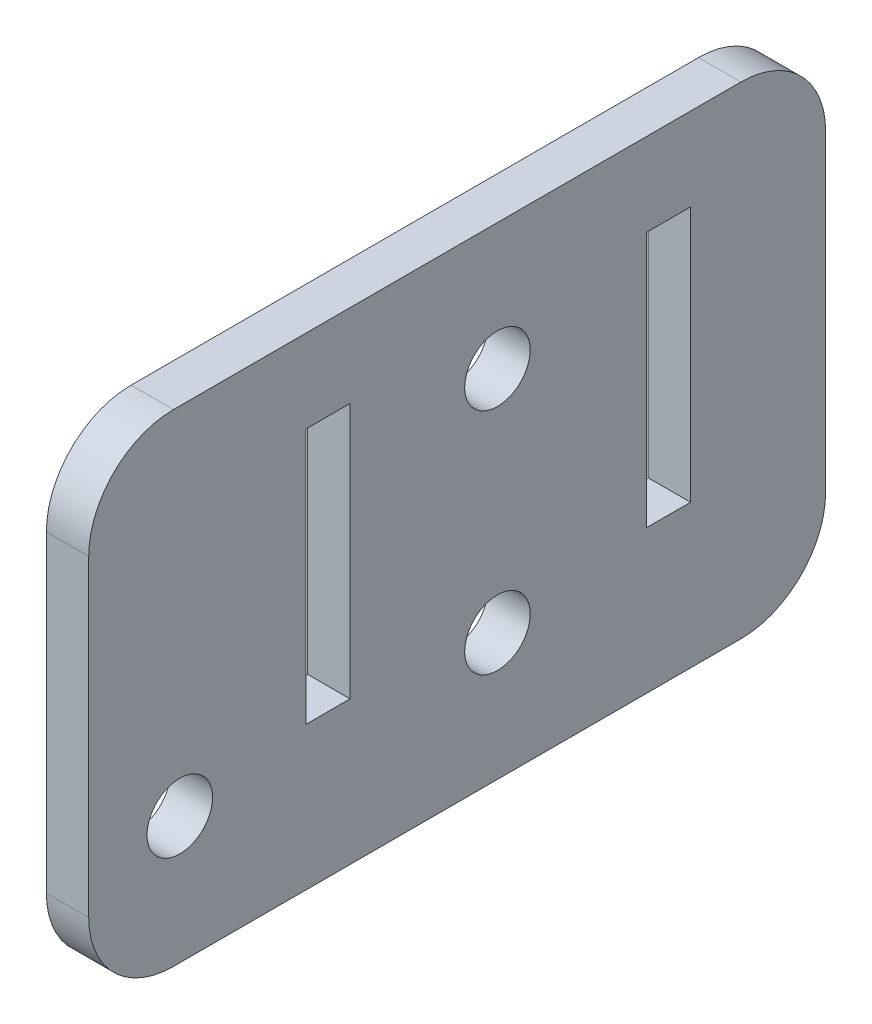
ISO-10303-21;
HEADER;
FILE_DESCRIPTION(('STEP AP214'),'2;1');
FILE_NAME('part.step','',(''),(''),'','','');
FILE_SCHEMA(('AUTOMOTIVE_DESIGN { 1 0 10303 214 1 1 1 1 }'));
ENDSEC;
DATA;
#1=APPLICATION_CONTEXT('core data for automotive mechanical design processes');
#2=APPLICATION_PROTOCOL_DEFINITION('international standard','automotive_design',2000,#1);
#3=PRODUCT_CONTEXT('',#1,'mechanical');
#4=PRODUCT('Part','Part','',(#3));
#5=PRODUCT_RELATED_PRODUCT_CATEGORY('part','',(#4));
#6=PRODUCT_DEFINITION_FORMATION('','',#4);
#7=PRODUCT_DEFINITION_CONTEXT('part definition',#1,'design');
#8=PRODUCT_DEFINITION('design','',#6,#7);
#9=PRODUCT_DEFINITION_SHAPE('','',#8);
#10=(LENGTH_UNIT() NAMED_UNIT(*) SI_UNIT(.MILLI.,.METRE.));
#11=(NAMED_UNIT(*) PLANE_ANGLE_UNIT() SI_UNIT($,.RADIAN.));
#12=(NAMED_UNIT(*) SI_UNIT($,.STERADIAN.) SOLID_ANGLE_UNIT());
#13=UNCERTAINTY_MEASURE_WITH_UNIT(LENGTH_MEASURE(1.E-05),#10,'distance_accuracy_value','');
#14=(GEOMETRIC_REPRESENTATION_CONTEXT(3) GLOBAL_UNCERTAINTY_ASSIGNED_CONTEXT((#13)) GLOBAL_UNIT_ASSIGNED_CONTEXT((#10,
#11,#12)) REPRESENTATION_CONTEXT('',''));
#15=CARTESIAN_POINT('',(0.,0.,0.));
#16=DIRECTION('',(0.,0.,1.));
#17=DIRECTION('',(1.,0.,0.));
#18=AXIS2_PLACEMENT_3D('',#15,#16,#17);
#19=CARTESIAN_POINT('',(3.175,0.,0.));
#20=DIRECTION('',(0.,1.,0.));
#21=DIRECTION('',(0.,0.,1.));
#22=AXIS2_PLACEMENT_3D('',#19,#20,#21);
#23=PLANE('',#22);
#24=DIRECTION('',(0.,0.,-1.));
#25=VECTOR('',#24,1.);
#26=CARTESIAN_POINT('',(3.175,0.,0.));
#27=LINE('',#26,#25);
#28=CARTESIAN_POINT('',(3.175,0.,-6.35));
#29=VERTEX_POINT('',#28);
#30=CARTESIAN_POINT('',(3.175,0.,-48.895));
#31=VERTEX_POINT('',#30);
#32=EDGE_CURVE('E264',#29,#31,#27,.T.);
#33=ORIENTED_EDGE('',*,*,#32,.F.);
#34=DIRECTION('',(-1.,0.,0.));
#35=VECTOR('',#34,1.);
#36=CARTESIAN_POINT('',(3.175,0.,-6.35));
#37=LINE('',#36,#35);
#38=CARTESIAN_POINT('',(0.,0.,-6.35));
#39=VERTEX_POINT('',#38);
#40=EDGE_CURVE('E332',#29,#39,#37,.T.);
#41=ORIENTED_EDGE('',*,*,#40,.T.);
#42=DIRECTION('',(0.,0.,-1.));
#43=VECTOR('',#42,1.);
#44=CARTESIAN_POINT('',(0.,0.,0.));
#45=LINE('',#44,#43);
#46=CARTESIAN_POINT('',(0.,0.,-48.895));
#47=VERTEX_POINT('',#46);
#48=EDGE_CURVE('E215',#39,#47,#45,.T.);
#49=ORIENTED_EDGE('',*,*,#48,.T.);
#50=DIRECTION('',(-1.,0.,0.));
#51=VECTOR('',#50,1.);
#52=CARTESIAN_POINT('',(3.175,0.,-48.895));
#53=LINE('',#52,#51);
#54=EDGE_CURVE('E329',#47,#31,#53,.F.);
#55=ORIENTED_EDGE('',*,*,#54,.T.);
#56=EDGE_LOOP('',(#33,#41,#49,#55));
#57=FACE_BOUND('',#56,.T.);
#58=ADVANCED_FACE('F47',(#57),#23,.F.);
#59=CARTESIAN_POINT('',(3.175,0.,-55.245));
#60=DIRECTION('',(0.,0.,1.));
#61=DIRECTION('',(1.,0.,0.));
#62=AXIS2_PLACEMENT_3D('',#59,#60,#61);
#63=PLANE('',#62);
#64=DIRECTION('',(0.,1.,0.));
#65=VECTOR('',#64,1.);
#66=CARTESIAN_POINT('',(0.,0.,-55.245));
#67=LINE('',#66,#65);
#68=CARTESIAN_POINT('',(0.,6.35,-55.245));
#69=VERTEX_POINT('',#68);
#70=CARTESIAN_POINT('',(0.,29.80436,-55.245));
#71=VERTEX_POINT('',#70);
#72=EDGE_CURVE('E283',#69,#71,#67,.T.);
#73=ORIENTED_EDGE('',*,*,#72,.T.);
#74=DIRECTION('',(-1.,0.,0.));
#75=VECTOR('',#74,1.);
#76=CARTESIAN_POINT('',(3.175,29.80436,-55.245));
#77=LINE('',#76,#75);
#78=CARTESIAN_POINT('',(3.175,29.80436,-55.245));
#79=VERTEX_POINT('',#78);
#80=EDGE_CURVE('E11',#71,#79,#77,.F.);
#81=ORIENTED_EDGE('',*,*,#80,.T.);
#82=DIRECTION('',(0.,1.,0.));
#83=VECTOR('',#82,1.);
#84=CARTESIAN_POINT('',(3.175,0.,-55.245));
#85=LINE('',#84,#83);
#86=CARTESIAN_POINT('',(3.175,6.35,-55.245));
#87=VERTEX_POINT('',#86);
#88=EDGE_CURVE('E267',#87,#79,#85,.T.);
#89=ORIENTED_EDGE('',*,*,#88,.F.);
#90=DIRECTION('',(-1.,0.,0.));
#91=VECTOR('',#90,1.);
#92=CARTESIAN_POINT('',(3.175,6.35,-55.245));
#93=LINE('',#92,#91);
#94=EDGE_CURVE('E56',#87,#69,#93,.T.);
#95=ORIENTED_EDGE('',*,*,#94,.T.);
#96=EDGE_LOOP('',(#73,#81,#89,#95));
#97=FACE_BOUND('',#96,.T.);
#98=ADVANCED_FACE('F339',(#97),#63,.F.);
#99=CARTESIAN_POINT('',(3.175,36.15436,-55.245));
#100=DIRECTION('',(0.,-1.,0.));
#101=DIRECTION('',(0.,0.,-1.));
#102=AXIS2_PLACEMENT_3D('',#99,#100,#101);
#103=PLANE('',#102);
#104=DIRECTION('',(0.,0.,1.));
#105=VECTOR('',#104,1.);
#106=CARTESIAN_POINT('',(0.,36.15436,-55.245));
#107=LINE('',#106,#105);
#108=CARTESIAN_POINT('',(0.,36.15436,-48.895));
#109=VERTEX_POINT('',#108);
#110=CARTESIAN_POINT('',(0.,36.15436,-6.35));
#111=VERTEX_POINT('',#110);
#112=EDGE_CURVE('E286',#109,#111,#107,.T.);
#113=ORIENTED_EDGE('',*,*,#112,.T.);
#114=DIRECTION('',(-1.,0.,0.));
#115=VECTOR('',#114,1.);
#116=CARTESIAN_POINT('',(3.175,36.15436,-6.35));
#117=LINE('',#116,#115);
#118=CARTESIAN_POINT('',(3.175,36.15436,-6.35));
#119=VERTEX_POINT('',#118);
#120=EDGE_CURVE('E315',#111,#119,#117,.F.);
#121=ORIENTED_EDGE('',*,*,#120,.T.);
#122=DIRECTION('',(0.,0.,1.));
#123=VECTOR('',#122,1.);
#124=CARTESIAN_POINT('',(3.175,36.15436,-55.245));
#125=LINE('',#124,#123);
#126=CARTESIAN_POINT('',(3.175,36.15436,-48.895));
#127=VERTEX_POINT('',#126);
#128=EDGE_CURVE('E271',#127,#119,#125,.T.);
#129=ORIENTED_EDGE('',*,*,#128,.F.);
#130=DIRECTION('',(-1.,0.,0.));
#131=VECTOR('',#130,1.);
#132=CARTESIAN_POINT('',(3.175,36.15436,-48.895));
#133=LINE('',#132,#131);
#134=EDGE_CURVE('E311',#127,#109,#133,.T.);
#135=ORIENTED_EDGE('',*,*,#134,.T.);
#136=EDGE_LOOP('',(#113,#121,#129,#135));
#137=FACE_BOUND('',#136,.T.);
#138=ADVANCED_FACE('F352',(#137),#103,.F.);
#139=CARTESIAN_POINT('',(3.175,36.15436,0.));
#140=DIRECTION('',(0.,0.,-1.));
#141=DIRECTION('',(-1.,0.,0.));
#142=AXIS2_PLACEMENT_3D('',#139,#140,#141);
#143=PLANE('',#142);
#144=DIRECTION('',(0.,-1.,0.));
#145=VECTOR('',#144,1.);
#146=CARTESIAN_POINT('',(3.175,36.15436,0.));
#147=LINE('',#146,#145);
#148=CARTESIAN_POINT('',(3.175,29.80436,0.));
#149=VERTEX_POINT('',#148);
#150=CARTESIAN_POINT('',(3.175,6.35,0.));
#151=VERTEX_POINT('',#150);
#152=EDGE_CURVE('E275',#149,#151,#147,.T.);
#153=ORIENTED_EDGE('',*,*,#152,.F.);
#154=DIRECTION('',(-1.,0.,0.));
#155=VECTOR('',#154,1.);
#156=CARTESIAN_POINT('',(3.175,29.80436,0.));
#157=LINE('',#156,#155);
#158=CARTESIAN_POINT('',(0.,29.80436,0.));
#159=VERTEX_POINT('',#158);
#160=EDGE_CURVE('E295',#149,#159,#157,.T.);
#161=ORIENTED_EDGE('',*,*,#160,.T.);
#162=DIRECTION('',(0.,-1.,0.));
#163=VECTOR('',#162,1.);
#164=CARTESIAN_POINT('',(0.,36.15436,0.));
#165=LINE('',#164,#163);
#166=CARTESIAN_POINT('',(0.,6.35,0.));
#167=VERTEX_POINT('',#166);
#168=EDGE_CURVE('E268',#159,#167,#165,.T.);
#169=ORIENTED_EDGE('',*,*,#168,.T.);
#170=DIRECTION('',(-1.,0.,0.));
#171=VECTOR('',#170,1.);
#172=CARTESIAN_POINT('',(3.175,6.35,0.));
#173=LINE('',#172,#171);
#174=EDGE_CURVE('E279',#167,#151,#173,.F.);
#175=ORIENTED_EDGE('',*,*,#174,.T.);
#176=EDGE_LOOP('',(#153,#161,#169,#175));
#177=FACE_BOUND('',#176,.T.);
#178=ADVANCED_FACE('F360',(#177),#143,.F.);
#179=CARTESIAN_POINT('',(3.175,0.,0.));
#180=DIRECTION('',(1.,0.,0.));
#181=DIRECTION('',(0.,0.,-1.));
#182=AXIS2_PLACEMENT_3D('',#179,#180,#181);
#183=PLANE('',#182);
#184=CARTESIAN_POINT('',(3.175,9.525,-30.642153092));
#185=DIRECTION('',(1.,0.,0.));
#186=DIRECTION('',(0.,0.,-1.));
#187=AXIS2_PLACEMENT_3D('',#184,#185,#186);
#188=CIRCLE('',#187,2.45744999999999);
#189=CARTESIAN_POINT('',(3.175,9.525,-33.099603092));
#190=VERTEX_POINT('',#189);
#191=EDGE_CURVE('E591',#190,#190,#188,.T.);
#192=ORIENTED_EDGE('',*,*,#191,.F.);
#193=EDGE_LOOP('',(#192));
#194=FACE_BOUND('',#193,.T.);
#195=CARTESIAN_POINT('',(3.175,26.67,-30.642153092));
#196=DIRECTION('',(1.,0.,0.));
#197=DIRECTION('',(0.,0.,-1.));
#198=AXIS2_PLACEMENT_3D('',#195,#196,#197);
#199=CIRCLE('',#198,2.45744999999999);
#200=CARTESIAN_POINT('',(3.175,26.67,-33.099603092));
#201=VERTEX_POINT('',#200);
#202=EDGE_CURVE('E582',#201,#201,#199,.T.);
#203=ORIENTED_EDGE('',*,*,#202,.F.);
#204=EDGE_LOOP('',(#203));
#205=FACE_BOUND('',#204,.T.);
#206=CARTESIAN_POINT('',(3.175,9.525,-6.829653092));
#207=DIRECTION('',(1.,0.,0.));
#208=DIRECTION('',(0.,0.,-1.));
#209=AXIS2_PLACEMENT_3D('',#206,#207,#208);
#210=CIRCLE('',#209,2.45744999999999);
#211=CARTESIAN_POINT('',(3.175,9.525,-9.28710309199999));
#212=VERTEX_POINT('',#211);
#213=EDGE_CURVE('E196',#212,#212,#210,.T.);
#214=ORIENTED_EDGE('',*,*,#213,.F.);
#215=EDGE_LOOP('',(#214));
#216=FACE_BOUND('',#215,.T.);
#217=DIRECTION('',(0.,-1.,0.));
#218=VECTOR('',#217,1.);
#219=CARTESIAN_POINT('',(3.175,10.75436,-45.120153092));
#220=LINE('',#219,#218);
#221=CARTESIAN_POINT('',(3.175,29.93136,-45.120153092));
#222=VERTEX_POINT('',#221);
#223=CARTESIAN_POINT('',(3.175,10.75436,-45.120153092));
#224=VERTEX_POINT('',#223);
#225=EDGE_CURVE('E165',#222,#224,#220,.T.);
#226=ORIENTED_EDGE('',*,*,#225,.T.);
#227=DIRECTION('',(0.,0.,1.));
#228=VECTOR('',#227,1.);
#229=CARTESIAN_POINT('',(3.175,10.75436,-45.120153092));
#230=LINE('',#229,#228);
#231=CARTESIAN_POINT('',(3.175,10.75436,-41.818153092));
#232=VERTEX_POINT('',#231);
#233=EDGE_CURVE('E178',#224,#232,#230,.T.);
#234=ORIENTED_EDGE('',*,*,#233,.T.);
#235=DIRECTION('',(0.,1.,0.));
#236=VECTOR('',#235,1.);
#237=CARTESIAN_POINT('',(3.175,10.75436,-41.818153092));
#238=LINE('',#237,#236);
#239=CARTESIAN_POINT('',(3.175,29.93136,-41.818153092));
#240=VERTEX_POINT('',#239);
#241=EDGE_CURVE('E183',#232,#240,#238,.T.);
#242=ORIENTED_EDGE('',*,*,#241,.T.);
#243=DIRECTION('',(0.,0.,-1.));
#244=VECTOR('',#243,1.);
#245=CARTESIAN_POINT('',(3.175,29.93136,-45.120153092));
#246=LINE('',#245,#244);
#247=EDGE_CURVE('E174',#240,#222,#246,.T.);
#248=ORIENTED_EDGE('',*,*,#247,.T.);
#249=EDGE_LOOP('',(#226,#234,#242,#248));
#250=FACE_BOUND('',#249,.T.);
#251=DIRECTION('',(0.,-1.,0.));
#252=VECTOR('',#251,1.);
#253=CARTESIAN_POINT('',(3.175,10.75436,-19.593153092));
#254=LINE('',#253,#252);
#255=CARTESIAN_POINT('',(3.175,29.93136,-19.593153092));
#256=VERTEX_POINT('',#255);
#257=CARTESIAN_POINT('',(3.175,10.75436,-19.593153092));
#258=VERTEX_POINT('',#257);
#259=EDGE_CURVE('E221',#256,#258,#254,.T.);
#260=ORIENTED_EDGE('',*,*,#259,.T.);
#261=DIRECTION('',(0.,0.,1.));
#262=VECTOR('',#261,1.);
#263=CARTESIAN_POINT('',(3.175,10.75436,-19.593153092));
#264=LINE('',#263,#262);
#265=CARTESIAN_POINT('',(3.175,10.75436,-16.291153092));
#266=VERTEX_POINT('',#265);
#267=EDGE_CURVE('E225',#258,#266,#264,.T.);
#268=ORIENTED_EDGE('',*,*,#267,.T.);
#269=DIRECTION('',(0.,1.,0.));
#270=VECTOR('',#269,1.);
#271=CARTESIAN_POINT('',(3.175,10.75436,-16.291153092));
#272=LINE('',#271,#270);
#273=CARTESIAN_POINT('',(3.175,29.93136,-16.291153092));
#274=VERTEX_POINT('',#273);
#275=EDGE_CURVE('E230',#266,#274,#272,.T.);
#276=ORIENTED_EDGE('',*,*,#275,.T.);
#277=DIRECTION('',(0.,0.,-1.));
#278=VECTOR('',#277,1.);
#279=CARTESIAN_POINT('',(3.175,29.93136,-19.593153092));
#280=LINE('',#279,#278);
#281=EDGE_CURVE('E234',#274,#256,#280,.T.);
#282=ORIENTED_EDGE('',*,*,#281,.T.);
#283=EDGE_LOOP('',(#260,#268,#276,#282));
#284=FACE_BOUND('',#283,.T.);
#285=ORIENTED_EDGE('',*,*,#128,.T.);
#286=CARTESIAN_POINT('',(3.175,29.80436,-6.35));
#287=DIRECTION('',(1.,0.,0.));
#288=DIRECTION('',(0.,0.,-1.));
#289=AXIS2_PLACEMENT_3D('',#286,#287,#288);
#290=CIRCLE('',#289,6.35);
#291=EDGE_CURVE('E326',#119,#149,#290,.T.);
#292=ORIENTED_EDGE('',*,*,#291,.T.);
#293=ORIENTED_EDGE('',*,*,#152,.T.);
#294=CARTESIAN_POINT('',(3.175,6.35,-6.35));
#295=DIRECTION('',(1.,0.,0.));
#296=DIRECTION('',(0.,0.,-1.));
#297=AXIS2_PLACEMENT_3D('',#294,#295,#296);
#298=CIRCLE('',#297,6.35);
#299=EDGE_CURVE('E323',#151,#29,#298,.T.);
#300=ORIENTED_EDGE('',*,*,#299,.T.);
#301=ORIENTED_EDGE('',*,*,#32,.T.);
#302=CARTESIAN_POINT('',(3.175,6.35,-48.895));
#303=DIRECTION('',(1.,0.,0.));
#304=DIRECTION('',(0.,0.,-1.));
#305=AXIS2_PLACEMENT_3D('',#302,#303,#304);
#306=CIRCLE('',#305,6.35);
#307=EDGE_CURVE('E68',#31,#87,#306,.T.);
#308=ORIENTED_EDGE('',*,*,#307,.T.);
#309=ORIENTED_EDGE('',*,*,#88,.T.);
#310=CARTESIAN_POINT('',(3.175,29.80436,-48.895));
#311=DIRECTION('',(1.,0.,0.));
#312=DIRECTION('',(0.,0.,-1.));
#313=AXIS2_PLACEMENT_3D('',#310,#311,#312);
#314=CIRCLE('',#313,6.35);
#315=EDGE_CURVE('E320',#79,#127,#314,.T.);
#316=ORIENTED_EDGE('',*,*,#315,.T.);
#317=EDGE_LOOP('',(#285,#292,#293,#300,#301,#308,#309,#316));
#318=FACE_BOUND('',#317,.T.);
#319=ADVANCED_FACE('F185',(#194,#205,#216,#250,#284,#318),#183,.T.);
#320=CARTESIAN_POINT('',(0.,0.,0.));
#321=DIRECTION('',(1.,0.,0.));
#322=DIRECTION('',(0.,0.,-1.));
#323=AXIS2_PLACEMENT_3D('',#320,#321,#322);
#324=PLANE('',#323);
#325=CARTESIAN_POINT('',(0.,9.525,-30.642153092));
#326=DIRECTION('',(-1.,0.,0.));
#327=DIRECTION('',(0.,0.,1.));
#328=AXIS2_PLACEMENT_3D('',#325,#326,#327);
#329=CIRCLE('',#328,2.45744999999999);
#330=CARTESIAN_POINT('',(0.,9.525,-28.184703092));
#331=VERTEX_POINT('',#330);
#332=EDGE_CURVE('E560',#331,#331,#329,.T.);
#333=ORIENTED_EDGE('',*,*,#332,.F.);
#334=EDGE_LOOP('',(#333));
#335=FACE_BOUND('',#334,.T.);
#336=CARTESIAN_POINT('',(0.,26.67,-30.642153092));
#337=DIRECTION('',(-1.,0.,0.));
#338=DIRECTION('',(0.,0.,1.));
#339=AXIS2_PLACEMENT_3D('',#336,#337,#338);
#340=CIRCLE('',#339,2.45744999999999);
#341=CARTESIAN_POINT('',(0.,26.67,-28.184703092));
#342=VERTEX_POINT('',#341);
#343=EDGE_CURVE('E564',#342,#342,#340,.T.);
#344=ORIENTED_EDGE('',*,*,#343,.F.);
#345=EDGE_LOOP('',(#344));
#346=FACE_BOUND('',#345,.T.);
#347=CARTESIAN_POINT('',(0.,9.525,-6.829653092));
#348=DIRECTION('',(-1.,0.,0.));
#349=DIRECTION('',(0.,0.,1.));
#350=AXIS2_PLACEMENT_3D('',#347,#348,#349);
#351=CIRCLE('',#350,2.45744999999999);
#352=CARTESIAN_POINT('',(0.,9.525,-4.37220309200001));
#353=VERTEX_POINT('',#352);
#354=EDGE_CURVE('E568',#353,#353,#351,.T.);
#355=ORIENTED_EDGE('',*,*,#354,.F.);
#356=EDGE_LOOP('',(#355));
#357=FACE_BOUND('',#356,.T.);
#358=DIRECTION('',(0.,0.,1.));
#359=VECTOR('',#358,1.);
#360=CARTESIAN_POINT('',(0.,10.75436,-45.120153092));
#361=LINE('',#360,#359);
#362=CARTESIAN_POINT('',(0.,10.75436,-45.120153092));
#363=VERTEX_POINT('',#362);
#364=CARTESIAN_POINT('',(0.,10.75436,-41.818153092));
#365=VERTEX_POINT('',#364);
#366=EDGE_CURVE('E205',#363,#365,#361,.T.);
#367=ORIENTED_EDGE('',*,*,#366,.F.);
#368=DIRECTION('',(0.,-1.,0.));
#369=VECTOR('',#368,1.);
#370=CARTESIAN_POINT('',(0.,10.75436,-45.120153092));
#371=LINE('',#370,#369);
#372=CARTESIAN_POINT('',(0.,29.93136,-45.120153092));
#373=VERTEX_POINT('',#372);
#374=EDGE_CURVE('E168',#373,#363,#371,.T.);
#375=ORIENTED_EDGE('',*,*,#374,.F.);
#376=DIRECTION('',(0.,0.,-1.));
#377=VECTOR('',#376,1.);
#378=CARTESIAN_POINT('',(0.,29.93136,-45.120153092));
#379=LINE('',#378,#377);
#380=CARTESIAN_POINT('',(0.,29.93136,-41.818153092));
#381=VERTEX_POINT('',#380);
#382=EDGE_CURVE('E189',#381,#373,#379,.T.);
#383=ORIENTED_EDGE('',*,*,#382,.F.);
#384=DIRECTION('',(0.,1.,0.));
#385=VECTOR('',#384,1.);
#386=CARTESIAN_POINT('',(0.,10.75436,-41.818153092));
#387=LINE('',#386,#385);
#388=EDGE_CURVE('E193',#365,#381,#387,.T.);
#389=ORIENTED_EDGE('',*,*,#388,.F.);
#390=EDGE_LOOP('',(#367,#375,#383,#389));
#391=FACE_BOUND('',#390,.T.);
#392=DIRECTION('',(0.,0.,1.));
#393=VECTOR('',#392,1.);
#394=CARTESIAN_POINT('',(0.,10.75436,-19.593153092));
#395=LINE('',#394,#393);
#396=CARTESIAN_POINT('',(0.,10.75436,-19.593153092));
#397=VERTEX_POINT('',#396);
#398=CARTESIAN_POINT('',(0.,10.75436,-16.291153092));
#399=VERTEX_POINT('',#398);
#400=EDGE_CURVE('E242',#397,#399,#395,.T.);
#401=ORIENTED_EDGE('',*,*,#400,.F.);
#402=DIRECTION('',(0.,-1.,0.));
#403=VECTOR('',#402,1.);
#404=CARTESIAN_POINT('',(0.,10.75436,-19.593153092));
#405=LINE('',#404,#403);
#406=CARTESIAN_POINT('',(0.,29.93136,-19.593153092));
#407=VERTEX_POINT('',#406);
#408=EDGE_CURVE('E239',#407,#397,#405,.T.);
#409=ORIENTED_EDGE('',*,*,#408,.F.);
#410=DIRECTION('',(0.,0.,-1.));
#411=VECTOR('',#410,1.);
#412=CARTESIAN_POINT('',(0.,29.93136,-19.593153092));
#413=LINE('',#412,#411);
#414=CARTESIAN_POINT('',(0.,29.93136,-16.291153092));
#415=VERTEX_POINT('',#414);
#416=EDGE_CURVE('E226',#415,#407,#413,.T.);
#417=ORIENTED_EDGE('',*,*,#416,.F.);
#418=DIRECTION('',(0.,1.,0.));
#419=VECTOR('',#418,1.);
#420=CARTESIAN_POINT('',(0.,10.75436,-16.291153092));
#421=LINE('',#420,#419);
#422=EDGE_CURVE('E246',#399,#415,#421,.T.);
#423=ORIENTED_EDGE('',*,*,#422,.F.);
#424=EDGE_LOOP('',(#401,#409,#417,#423));
#425=FACE_BOUND('',#424,.T.);
#426=ORIENTED_EDGE('',*,*,#168,.F.);
#427=CARTESIAN_POINT('',(0.,29.80436,-6.35));
#428=DIRECTION('',(1.,0.,0.));
#429=DIRECTION('',(0.,0.,-1.));
#430=AXIS2_PLACEMENT_3D('',#427,#428,#429);
#431=CIRCLE('',#430,6.35);
#432=EDGE_CURVE('E308',#159,#111,#431,.F.);
#433=ORIENTED_EDGE('',*,*,#432,.T.);
#434=ORIENTED_EDGE('',*,*,#112,.F.);
#435=CARTESIAN_POINT('',(0.,29.80436,-48.895));
#436=DIRECTION('',(1.,0.,0.));
#437=DIRECTION('',(0.,0.,-1.));
#438=AXIS2_PLACEMENT_3D('',#435,#436,#437);
#439=CIRCLE('',#438,6.35);
#440=EDGE_CURVE('E302',#109,#71,#439,.F.);
#441=ORIENTED_EDGE('',*,*,#440,.T.);
#442=ORIENTED_EDGE('',*,*,#72,.F.);
#443=CARTESIAN_POINT('',(0.,6.35,-48.895));
#444=DIRECTION('',(1.,0.,0.));
#445=DIRECTION('',(0.,0.,-1.));
#446=AXIS2_PLACEMENT_3D('',#443,#444,#445);
#447=CIRCLE('',#446,6.35);
#448=EDGE_CURVE('E299',#69,#47,#447,.F.);
#449=ORIENTED_EDGE('',*,*,#448,.T.);
#450=ORIENTED_EDGE('',*,*,#48,.F.);
#451=CARTESIAN_POINT('',(0.,6.35,-6.35));
#452=DIRECTION('',(1.,0.,0.));
#453=DIRECTION('',(0.,0.,-1.));
#454=AXIS2_PLACEMENT_3D('',#451,#452,#453);
#455=CIRCLE('',#454,6.35);
#456=EDGE_CURVE('E305',#39,#167,#455,.F.);
#457=ORIENTED_EDGE('',*,*,#456,.T.);
#458=EDGE_LOOP('',(#426,#433,#434,#441,#442,#449,#450,#457));
#459=FACE_BOUND('',#458,.T.);
#460=ADVANCED_FACE('F343',(#335,#346,#357,#391,#425,#459),#324,.F.);
#461=CARTESIAN_POINT('',(3.175,10.75436,-19.593153092));
#462=DIRECTION('',(0.,0.,-1.));
#463=DIRECTION('',(-1.,0.,0.));
#464=AXIS2_PLACEMENT_3D('',#461,#462,#463);
#465=PLANE('',#464);
#466=ORIENTED_EDGE('',*,*,#408,.T.);
#467=DIRECTION('',(-1.,0.,0.));
#468=VECTOR('',#467,1.);
#469=CARTESIAN_POINT('',(3.175,10.75436,-19.593153092));
#470=LINE('',#469,#468);
#471=EDGE_CURVE('E238',#258,#397,#470,.T.);
#472=ORIENTED_EDGE('',*,*,#471,.F.);
#473=ORIENTED_EDGE('',*,*,#259,.F.);
#474=DIRECTION('',(-1.,0.,0.));
#475=VECTOR('',#474,1.);
#476=CARTESIAN_POINT('',(3.175,29.93136,-19.593153092));
#477=LINE('',#476,#475);
#478=EDGE_CURVE('E206',#256,#407,#477,.T.);
#479=ORIENTED_EDGE('',*,*,#478,.T.);
#480=EDGE_LOOP('',(#466,#472,#473,#479));
#481=FACE_BOUND('',#480,.T.);
#482=ADVANCED_FACE('F454',(#481),#465,.F.);
#483=CARTESIAN_POINT('',(3.175,29.93136,-19.593153092));
#484=DIRECTION('',(0.,1.,0.));
#485=DIRECTION('',(0.,0.,1.));
#486=AXIS2_PLACEMENT_3D('',#483,#484,#485);
#487=PLANE('',#486);
#488=ORIENTED_EDGE('',*,*,#416,.T.);
#489=ORIENTED_EDGE('',*,*,#478,.F.);
#490=ORIENTED_EDGE('',*,*,#281,.F.);
#491=DIRECTION('',(-1.,0.,0.));
#492=VECTOR('',#491,1.);
#493=CARTESIAN_POINT('',(3.175,29.93136,-16.291153092));
#494=LINE('',#493,#492);
#495=EDGE_CURVE('E255',#274,#415,#494,.T.);
#496=ORIENTED_EDGE('',*,*,#495,.T.);
#497=EDGE_LOOP('',(#488,#489,#490,#496));
#498=FACE_BOUND('',#497,.T.);
#499=ADVANCED_FACE('F450',(#498),#487,.F.);
#500=CARTESIAN_POINT('',(3.175,10.75436,-16.291153092));
#501=DIRECTION('',(0.,0.,1.));
#502=DIRECTION('',(1.,0.,0.));
#503=AXIS2_PLACEMENT_3D('',#500,#501,#502);
#504=PLANE('',#503);
#505=ORIENTED_EDGE('',*,*,#422,.T.);
#506=ORIENTED_EDGE('',*,*,#495,.F.);
#507=ORIENTED_EDGE('',*,*,#275,.F.);
#508=DIRECTION('',(-1.,0.,0.));
#509=VECTOR('',#508,1.);
#510=CARTESIAN_POINT('',(3.175,10.75436,-16.291153092));
#511=LINE('',#510,#509);
#512=EDGE_CURVE('E258',#266,#399,#511,.T.);
#513=ORIENTED_EDGE('',*,*,#512,.T.);
#514=EDGE_LOOP('',(#505,#506,#507,#513));
#515=FACE_BOUND('',#514,.T.);
#516=ADVANCED_FACE('F453',(#515),#504,.F.);
#517=CARTESIAN_POINT('',(3.175,10.75436,-19.593153092));
#518=DIRECTION('',(0.,-1.,0.));
#519=DIRECTION('',(0.,0.,-1.));
#520=AXIS2_PLACEMENT_3D('',#517,#518,#519);
#521=PLANE('',#520);
#522=ORIENTED_EDGE('',*,*,#400,.T.);
#523=ORIENTED_EDGE('',*,*,#512,.F.);
#524=ORIENTED_EDGE('',*,*,#267,.F.);
#525=ORIENTED_EDGE('',*,*,#471,.T.);
#526=EDGE_LOOP('',(#522,#523,#524,#525));
#527=FACE_BOUND('',#526,.T.);
#528=ADVANCED_FACE('F449',(#527),#521,.F.);
#529=CARTESIAN_POINT('',(3.175,10.75436,-45.120153092));
#530=DIRECTION('',(0.,0.,-1.));
#531=DIRECTION('',(-1.,0.,0.));
#532=AXIS2_PLACEMENT_3D('',#529,#530,#531);
#533=PLANE('',#532);
#534=ORIENTED_EDGE('',*,*,#374,.T.);
#535=DIRECTION('',(-1.,0.,0.));
#536=VECTOR('',#535,1.);
#537=CARTESIAN_POINT('',(3.175,10.75436,-45.120153092));
#538=LINE('',#537,#536);
#539=EDGE_CURVE('E161',#224,#363,#538,.T.);
#540=ORIENTED_EDGE('',*,*,#539,.F.);
#541=ORIENTED_EDGE('',*,*,#225,.F.);
#542=DIRECTION('',(-1.,0.,0.));
#543=VECTOR('',#542,1.);
#544=CARTESIAN_POINT('',(3.175,29.93136,-45.120153092));
#545=LINE('',#544,#543);
#546=EDGE_CURVE('E212',#222,#373,#545,.T.);
#547=ORIENTED_EDGE('',*,*,#546,.T.);
#548=EDGE_LOOP('',(#534,#540,#541,#547));
#549=FACE_BOUND('',#548,.T.);
#550=ADVANCED_FACE('F163',(#549),#533,.F.);
#551=CARTESIAN_POINT('',(3.175,29.93136,-45.120153092));
#552=DIRECTION('',(0.,1.,0.));
#553=DIRECTION('',(0.,0.,1.));
#554=AXIS2_PLACEMENT_3D('',#551,#552,#553);
#555=PLANE('',#554);
#556=ORIENTED_EDGE('',*,*,#382,.T.);
#557=ORIENTED_EDGE('',*,*,#546,.F.);
#558=ORIENTED_EDGE('',*,*,#247,.F.);
#559=DIRECTION('',(-1.,0.,0.));
#560=VECTOR('',#559,1.);
#561=CARTESIAN_POINT('',(3.175,29.93136,-41.818153092));
#562=LINE('',#561,#560);
#563=EDGE_CURVE('E216',#240,#381,#562,.T.);
#564=ORIENTED_EDGE('',*,*,#563,.T.);
#565=EDGE_LOOP('',(#556,#557,#558,#564));
#566=FACE_BOUND('',#565,.T.);
#567=ADVANCED_FACE('F438',(#566),#555,.F.);
#568=CARTESIAN_POINT('',(3.175,10.75436,-41.818153092));
#569=DIRECTION('',(0.,0.,1.));
#570=DIRECTION('',(1.,0.,0.));
#571=AXIS2_PLACEMENT_3D('',#568,#569,#570);
#572=PLANE('',#571);
#573=ORIENTED_EDGE('',*,*,#388,.T.);
#574=ORIENTED_EDGE('',*,*,#563,.F.);
#575=ORIENTED_EDGE('',*,*,#241,.F.);
#576=DIRECTION('',(-1.,0.,0.));
#577=VECTOR('',#576,1.);
#578=CARTESIAN_POINT('',(3.175,10.75436,-41.818153092));
#579=LINE('',#578,#577);
#580=EDGE_CURVE('E173',#232,#365,#579,.T.);
#581=ORIENTED_EDGE('',*,*,#580,.T.);
#582=EDGE_LOOP('',(#573,#574,#575,#581));
#583=FACE_BOUND('',#582,.T.);
#584=ADVANCED_FACE('F441',(#583),#572,.F.);
#585=CARTESIAN_POINT('',(3.175,10.75436,-45.120153092));
#586=DIRECTION('',(0.,-1.,0.));
#587=DIRECTION('',(0.,0.,-1.));
#588=AXIS2_PLACEMENT_3D('',#585,#586,#587);
#589=PLANE('',#588);
#590=ORIENTED_EDGE('',*,*,#366,.T.);
#591=ORIENTED_EDGE('',*,*,#580,.F.);
#592=ORIENTED_EDGE('',*,*,#233,.F.);
#593=ORIENTED_EDGE('',*,*,#539,.T.);
#594=EDGE_LOOP('',(#590,#591,#592,#593));
#595=FACE_BOUND('',#594,.T.);
#596=ADVANCED_FACE('F179',(#595),#589,.F.);
#597=CARTESIAN_POINT('',(3.175,29.80436,-6.35));
#598=DIRECTION('',(-1.,0.,0.));
#599=DIRECTION('',(0.,0.,1.));
#600=AXIS2_PLACEMENT_3D('',#597,#598,#599);
#601=CYLINDRICAL_SURFACE('',#600,6.35);
#602=ORIENTED_EDGE('',*,*,#291,.F.);
#603=ORIENTED_EDGE('',*,*,#120,.F.);
#604=ORIENTED_EDGE('',*,*,#432,.F.);
#605=ORIENTED_EDGE('',*,*,#160,.F.);
#606=EDGE_LOOP('',(#602,#603,#604,#605));
#607=FACE_BOUND('',#606,.T.);
#608=ADVANCED_FACE('F358',(#607),#601,.T.);
#609=CARTESIAN_POINT('',(3.175,6.35,-6.35));
#610=DIRECTION('',(-1.,0.,0.));
#611=DIRECTION('',(0.,0.,1.));
#612=AXIS2_PLACEMENT_3D('',#609,#610,#611);
#613=CYLINDRICAL_SURFACE('',#612,6.35);
#614=ORIENTED_EDGE('',*,*,#299,.F.);
#615=ORIENTED_EDGE('',*,*,#174,.F.);
#616=ORIENTED_EDGE('',*,*,#456,.F.);
#617=ORIENTED_EDGE('',*,*,#40,.F.);
#618=EDGE_LOOP('',(#614,#615,#616,#617));
#619=FACE_BOUND('',#618,.T.);
#620=ADVANCED_FACE('F365',(#619),#613,.T.);
#621=CARTESIAN_POINT('',(3.175,29.80436,-48.895));
#622=DIRECTION('',(-1.,0.,0.));
#623=DIRECTION('',(0.,0.,1.));
#624=AXIS2_PLACEMENT_3D('',#621,#622,#623);
#625=CYLINDRICAL_SURFACE('',#624,6.35);
#626=ORIENTED_EDGE('',*,*,#315,.F.);
#627=ORIENTED_EDGE('',*,*,#80,.F.);
#628=ORIENTED_EDGE('',*,*,#440,.F.);
#629=ORIENTED_EDGE('',*,*,#134,.F.);
#630=EDGE_LOOP('',(#626,#627,#628,#629));
#631=FACE_BOUND('',#630,.T.);
#632=ADVANCED_FACE('F349',(#631),#625,.T.);
#633=CARTESIAN_POINT('',(3.175,6.35,-48.895));
#634=DIRECTION('',(-1.,0.,0.));
#635=DIRECTION('',(0.,0.,1.));
#636=AXIS2_PLACEMENT_3D('',#633,#634,#635);
#637=CYLINDRICAL_SURFACE('',#636,6.35);
#638=ORIENTED_EDGE('',*,*,#307,.F.);
#639=ORIENTED_EDGE('',*,*,#54,.F.);
#640=ORIENTED_EDGE('',*,*,#448,.F.);
#641=ORIENTED_EDGE('',*,*,#94,.F.);
#642=EDGE_LOOP('',(#638,#639,#640,#641));
#643=FACE_BOUND('',#642,.T.);
#644=ADVANCED_FACE('F49',(#643),#637,.T.);
#645=CARTESIAN_POINT('',(0.,9.525,-6.829653092));
#646=DIRECTION('',(-1.,0.,0.));
#647=DIRECTION('',(0.,0.,1.));
#648=AXIS2_PLACEMENT_3D('',#645,#646,#647);
#649=CYLINDRICAL_SURFACE('',#648,2.45744999999999);
#650=ORIENTED_EDGE('',*,*,#213,.T.);
#651=EDGE_LOOP('',(#650));
#652=FACE_BOUND('',#651,.T.);
#653=ORIENTED_EDGE('',*,*,#354,.T.);
#654=EDGE_LOOP('',(#653));
#655=FACE_BOUND('',#654,.T.);
#656=ADVANCED_FACE('F370',(#652,#655),#649,.F.);
#657=CARTESIAN_POINT('',(0.,26.67,-30.642153092));
#658=DIRECTION('',(-1.,0.,0.));
#659=DIRECTION('',(0.,0.,1.));
#660=AXIS2_PLACEMENT_3D('',#657,#658,#659);
#661=CYLINDRICAL_SURFACE('',#660,2.45744999999999);
#662=ORIENTED_EDGE('',*,*,#202,.T.);
#663=EDGE_LOOP('',(#662));
#664=FACE_BOUND('',#663,.T.);
#665=ORIENTED_EDGE('',*,*,#343,.T.);
#666=EDGE_LOOP('',(#665));
#667=FACE_BOUND('',#666,.T.);
#668=ADVANCED_FACE('F376',(#664,#667),#661,.F.);
#669=CARTESIAN_POINT('',(0.,9.525,-30.642153092));
#670=DIRECTION('',(-1.,0.,0.));
#671=DIRECTION('',(0.,0.,1.));
#672=AXIS2_PLACEMENT_3D('',#669,#670,#671);
#673=CYLINDRICAL_SURFACE('',#672,2.45744999999999);
#674=ORIENTED_EDGE('',*,*,#191,.T.);
#675=EDGE_LOOP('',(#674));
#676=FACE_BOUND('',#675,.T.);
#677=ORIENTED_EDGE('',*,*,#332,.T.);
#678=EDGE_LOOP('',(#677));
#679=FACE_BOUND('',#678,.T.);
#680=ADVANCED_FACE('F422',(#676,#679),#673,.F.);
#681=CLOSED_SHELL('',(#58,#98,#138,#178,#319,#460,#482,#499,#516,#528,#550,#567,#584,#596,#608,
#620,#632,#644,#656,#668,#680));
#682=MANIFOLD_SOLID_BREP('B2',#681);
#683=ADVANCED_BREP_SHAPE_REPRESENTATION('',(#18,#682),#14);
#684=SHAPE_DEFINITION_REPRESENTATION(#9,#683);
ENDSEC;
END-ISO-10303-21;
